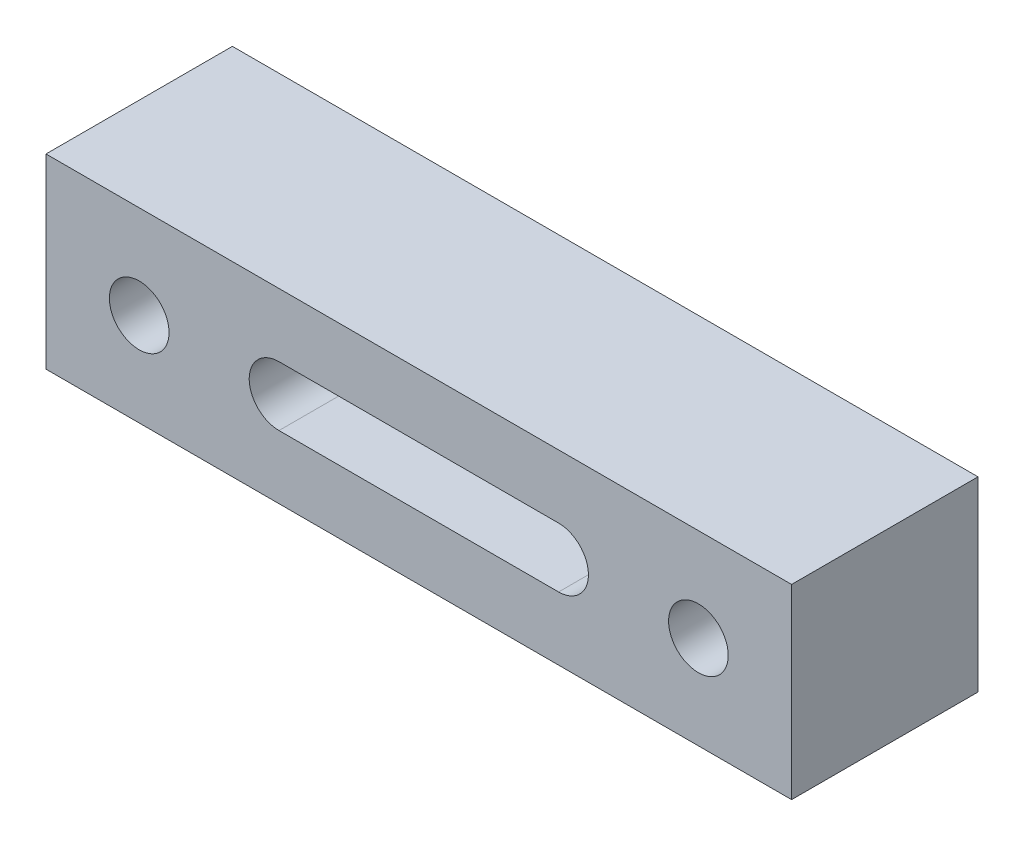
ISO-10303-21;
HEADER;
FILE_DESCRIPTION(('STEP AP214'),'2;1');
FILE_NAME('part.step','',(''),(''),'','','');
FILE_SCHEMA(('AUTOMOTIVE_DESIGN { 1 0 10303 214 1 1 1 1 }'));
ENDSEC;
DATA;
#1=APPLICATION_CONTEXT('core data for automotive mechanical design processes');
#2=APPLICATION_PROTOCOL_DEFINITION('international standard','automotive_design',2000,#1);
#3=PRODUCT_CONTEXT('',#1,'mechanical');
#4=PRODUCT('Part','Part','',(#3));
#5=PRODUCT_RELATED_PRODUCT_CATEGORY('part','',(#4));
#6=PRODUCT_DEFINITION_FORMATION('','',#4);
#7=PRODUCT_DEFINITION_CONTEXT('part definition',#1,'design');
#8=PRODUCT_DEFINITION('design','',#6,#7);
#9=PRODUCT_DEFINITION_SHAPE('','',#8);
#10=(LENGTH_UNIT() NAMED_UNIT(*) SI_UNIT(.MILLI.,.METRE.));
#11=(NAMED_UNIT(*) PLANE_ANGLE_UNIT() SI_UNIT($,.RADIAN.));
#12=(NAMED_UNIT(*) SI_UNIT($,.STERADIAN.) SOLID_ANGLE_UNIT());
#13=UNCERTAINTY_MEASURE_WITH_UNIT(LENGTH_MEASURE(1.E-05),#10,'distance_accuracy_value','');
#14=(GEOMETRIC_REPRESENTATION_CONTEXT(3) GLOBAL_UNCERTAINTY_ASSIGNED_CONTEXT((#13)) GLOBAL_UNIT_ASSIGNED_CONTEXT((#10,
#11,#12)) REPRESENTATION_CONTEXT('',''));
#15=CARTESIAN_POINT('',(0.,0.,0.));
#16=DIRECTION('',(0.,0.,1.));
#17=DIRECTION('',(1.,0.,0.));
#18=AXIS2_PLACEMENT_3D('',#15,#16,#17);
#19=CARTESIAN_POINT('',(-14.3181818181818,13.5885167464115,10.));
#20=DIRECTION('',(0.,0.,-1.));
#21=DIRECTION('',(-1.,0.,0.));
#22=AXIS2_PLACEMENT_3D('',#19,#20,#21);
#23=CYLINDRICAL_SURFACE('',#22,1.6);
#24=DIRECTION('',(0.,0.,-1.));
#25=VECTOR('',#24,1.);
#26=CARTESIAN_POINT('',(-14.3181818181818,11.9885167464115,10.));
#27=LINE('',#26,#25);
#28=CARTESIAN_POINT('',(-14.3181818181818,11.9885167464115,10.));
#29=VERTEX_POINT('',#28);
#30=CARTESIAN_POINT('',(-14.3181818181818,11.9885167464115,6.));
#31=VERTEX_POINT('',#30);
#32=EDGE_CURVE('E219',#29,#31,#27,.T.);
#33=ORIENTED_EDGE('',*,*,#32,.T.);
#34=CARTESIAN_POINT('',(-14.3181818181818,13.5885167464115,6.));
#35=DIRECTION('',(0.,0.,-1.));
#36=DIRECTION('',(-1.,0.,0.));
#37=AXIS2_PLACEMENT_3D('',#34,#35,#36);
#38=CIRCLE('',#37,1.6);
#39=CARTESIAN_POINT('',(-14.3181818181818,15.1885167464115,6.));
#40=VERTEX_POINT('',#39);
#41=EDGE_CURVE('E190',#31,#40,#38,.T.);
#42=ORIENTED_EDGE('',*,*,#41,.T.);
#43=DIRECTION('',(0.,0.,-1.));
#44=VECTOR('',#43,1.);
#45=CARTESIAN_POINT('',(-14.3181818181818,15.1885167464115,10.));
#46=LINE('',#45,#44);
#47=CARTESIAN_POINT('',(-14.3181818181818,15.1885167464115,10.));
#48=VERTEX_POINT('',#47);
#49=EDGE_CURVE('E207',#48,#40,#46,.T.);
#50=ORIENTED_EDGE('',*,*,#49,.F.);
#51=CARTESIAN_POINT('',(-14.3181818181818,13.5885167464115,10.));
#52=DIRECTION('',(0.,0.,1.));
#53=DIRECTION('',(1.,0.,0.));
#54=AXIS2_PLACEMENT_3D('',#51,#52,#53);
#55=CIRCLE('',#54,1.6);
#56=EDGE_CURVE('E194',#48,#29,#55,.T.);
#57=ORIENTED_EDGE('',*,*,#56,.T.);
#58=EDGE_LOOP('',(#33,#42,#50,#57));
#59=FACE_BOUND('',#58,.T.);
#60=ADVANCED_FACE('F45',(#59),#23,.F.);
#61=CARTESIAN_POINT('',(-14.3181818181818,11.9885167464115,10.));
#62=DIRECTION('',(0.,1.,0.));
#63=DIRECTION('',(-1.,0.,0.));
#64=AXIS2_PLACEMENT_3D('',#61,#62,#63);
#65=PLANE('',#64);
#66=DIRECTION('',(0.,0.,-1.));
#67=VECTOR('',#66,1.);
#68=CARTESIAN_POINT('',(0.681818181818196,11.9885167464115,10.));
#69=LINE('',#68,#67);
#70=CARTESIAN_POINT('',(0.681818181818196,11.9885167464115,10.));
#71=VERTEX_POINT('',#70);
#72=CARTESIAN_POINT('',(0.681818181818196,11.9885167464115,6.));
#73=VERTEX_POINT('',#72);
#74=EDGE_CURVE('E215',#71,#73,#69,.T.);
#75=ORIENTED_EDGE('',*,*,#74,.T.);
#76=DIRECTION('',(-1.,0.,0.));
#77=VECTOR('',#76,1.);
#78=CARTESIAN_POINT('',(-14.3181818181818,11.9885167464115,6.));
#79=LINE('',#78,#77);
#80=EDGE_CURVE('E186',#73,#31,#79,.T.);
#81=ORIENTED_EDGE('',*,*,#80,.T.);
#82=ORIENTED_EDGE('',*,*,#32,.F.);
#83=DIRECTION('',(1.,0.,0.));
#84=VECTOR('',#83,1.);
#85=CARTESIAN_POINT('',(-14.3181818181818,11.9885167464115,10.));
#86=LINE('',#85,#84);
#87=EDGE_CURVE('E197',#29,#71,#86,.T.);
#88=ORIENTED_EDGE('',*,*,#87,.T.);
#89=EDGE_LOOP('',(#75,#81,#82,#88));
#90=FACE_BOUND('',#89,.T.);
#91=ADVANCED_FACE('F313',(#90),#65,.T.);
#92=CARTESIAN_POINT('',(0.681818181818197,13.5885167464115,10.));
#93=DIRECTION('',(0.,0.,-1.));
#94=DIRECTION('',(-1.,0.,0.));
#95=AXIS2_PLACEMENT_3D('',#92,#93,#94);
#96=CYLINDRICAL_SURFACE('',#95,1.6);
#97=DIRECTION('',(0.,0.,-1.));
#98=VECTOR('',#97,1.);
#99=CARTESIAN_POINT('',(0.681818181818197,15.1885167464115,10.));
#100=LINE('',#99,#98);
#101=CARTESIAN_POINT('',(0.681818181818197,15.1885167464115,10.));
#102=VERTEX_POINT('',#101);
#103=CARTESIAN_POINT('',(0.681818181818197,15.1885167464115,6.));
#104=VERTEX_POINT('',#103);
#105=EDGE_CURVE('E211',#102,#104,#100,.T.);
#106=ORIENTED_EDGE('',*,*,#105,.T.);
#107=CARTESIAN_POINT('',(0.681818181818197,13.5885167464115,6.));
#108=DIRECTION('',(0.,0.,-1.));
#109=DIRECTION('',(-1.,0.,0.));
#110=AXIS2_PLACEMENT_3D('',#107,#108,#109);
#111=CIRCLE('',#110,1.6);
#112=EDGE_CURVE('E69',#104,#73,#111,.T.);
#113=ORIENTED_EDGE('',*,*,#112,.T.);
#114=ORIENTED_EDGE('',*,*,#74,.F.);
#115=CARTESIAN_POINT('',(0.681818181818197,13.5885167464115,10.));
#116=DIRECTION('',(0.,0.,1.));
#117=DIRECTION('',(1.,0.,0.));
#118=AXIS2_PLACEMENT_3D('',#115,#116,#117);
#119=CIRCLE('',#118,1.6);
#120=EDGE_CURVE('E200',#71,#102,#119,.T.);
#121=ORIENTED_EDGE('',*,*,#120,.T.);
#122=EDGE_LOOP('',(#106,#113,#114,#121));
#123=FACE_BOUND('',#122,.T.);
#124=ADVANCED_FACE('F315',(#123),#96,.F.);
#125=CARTESIAN_POINT('',(-14.3181818181818,15.1885167464115,10.));
#126=DIRECTION('',(0.,-1.,0.));
#127=DIRECTION('',(1.,0.,0.));
#128=AXIS2_PLACEMENT_3D('',#125,#126,#127);
#129=PLANE('',#128);
#130=ORIENTED_EDGE('',*,*,#49,.T.);
#131=DIRECTION('',(1.,0.,0.));
#132=VECTOR('',#131,1.);
#133=CARTESIAN_POINT('',(-14.3181818181818,15.1885167464115,6.));
#134=LINE('',#133,#132);
#135=EDGE_CURVE('E12',#40,#104,#134,.T.);
#136=ORIENTED_EDGE('',*,*,#135,.T.);
#137=ORIENTED_EDGE('',*,*,#105,.F.);
#138=DIRECTION('',(-1.,0.,0.));
#139=VECTOR('',#138,1.);
#140=CARTESIAN_POINT('',(-14.3181818181818,15.1885167464115,10.));
#141=LINE('',#140,#139);
#142=EDGE_CURVE('E204',#102,#48,#141,.T.);
#143=ORIENTED_EDGE('',*,*,#142,.T.);
#144=EDGE_LOOP('',(#130,#136,#137,#143));
#145=FACE_BOUND('',#144,.T.);
#146=ADVANCED_FACE('F301',(#145),#129,.T.);
#147=CARTESIAN_POINT('',(0.,0.,10.));
#148=DIRECTION('',(0.,0.,1.));
#149=DIRECTION('',(1.,0.,0.));
#150=AXIS2_PLACEMENT_3D('',#147,#148,#149);
#151=PLANE('',#150);
#152=CARTESIAN_POINT('',(-21.8181818181818,13.5885167464115,10.));
#153=DIRECTION('',(0.,0.,1.));
#154=DIRECTION('',(1.,0.,0.));
#155=AXIS2_PLACEMENT_3D('',#152,#153,#154);
#156=CIRCLE('',#155,1.6);
#157=CARTESIAN_POINT('',(-20.2181818181818,13.5885167464115,10.));
#158=VERTEX_POINT('',#157);
#159=EDGE_CURVE('E232',#158,#158,#156,.T.);
#160=ORIENTED_EDGE('',*,*,#159,.F.);
#161=EDGE_LOOP('',(#160));
#162=FACE_BOUND('',#161,.T.);
#163=DIRECTION('',(0.,-1.,0.));
#164=VECTOR('',#163,1.);
#165=CARTESIAN_POINT('',(-26.8181818181818,18.5885167464115,10.));
#166=LINE('',#165,#164);
#167=CARTESIAN_POINT('',(-26.8181818181818,18.5885167464115,10.));
#168=VERTEX_POINT('',#167);
#169=CARTESIAN_POINT('',(-26.8181818181818,8.58851674641148,10.));
#170=VERTEX_POINT('',#169);
#171=EDGE_CURVE('E240',#168,#170,#166,.T.);
#172=ORIENTED_EDGE('',*,*,#171,.T.);
#173=DIRECTION('',(1.,0.,0.));
#174=VECTOR('',#173,1.);
#175=CARTESIAN_POINT('',(-26.8181818181818,8.58851674641148,10.));
#176=LINE('',#175,#174);
#177=CARTESIAN_POINT('',(13.1818181818182,8.58851674641148,10.));
#178=VERTEX_POINT('',#177);
#179=EDGE_CURVE('E244',#170,#178,#176,.T.);
#180=ORIENTED_EDGE('',*,*,#179,.T.);
#181=DIRECTION('',(0.,1.,0.));
#182=VECTOR('',#181,1.);
#183=CARTESIAN_POINT('',(13.1818181818182,18.5885167464115,10.));
#184=LINE('',#183,#182);
#185=CARTESIAN_POINT('',(13.1818181818182,18.5885167464115,10.));
#186=VERTEX_POINT('',#185);
#187=EDGE_CURVE('E248',#178,#186,#184,.T.);
#188=ORIENTED_EDGE('',*,*,#187,.T.);
#189=DIRECTION('',(-1.,0.,0.));
#190=VECTOR('',#189,1.);
#191=CARTESIAN_POINT('',(-26.8181818181818,18.5885167464115,10.));
#192=LINE('',#191,#190);
#193=EDGE_CURVE('E251',#186,#168,#192,.T.);
#194=ORIENTED_EDGE('',*,*,#193,.T.);
#195=EDGE_LOOP('',(#172,#180,#188,#194));
#196=FACE_BOUND('',#195,.T.);
#197=CARTESIAN_POINT('',(8.18181818181819,13.5885167464115,10.));
#198=DIRECTION('',(0.,0.,1.));
#199=DIRECTION('',(1.,0.,0.));
#200=AXIS2_PLACEMENT_3D('',#197,#198,#199);
#201=CIRCLE('',#200,1.6);
#202=CARTESIAN_POINT('',(9.7818181818182,13.5885167464115,10.));
#203=VERTEX_POINT('',#202);
#204=EDGE_CURVE('E224',#203,#203,#201,.T.);
#205=ORIENTED_EDGE('',*,*,#204,.F.);
#206=EDGE_LOOP('',(#205));
#207=FACE_BOUND('',#206,.T.);
#208=ORIENTED_EDGE('',*,*,#87,.F.);
#209=ORIENTED_EDGE('',*,*,#56,.F.);
#210=ORIENTED_EDGE('',*,*,#142,.F.);
#211=ORIENTED_EDGE('',*,*,#120,.F.);
#212=EDGE_LOOP('',(#208,#209,#210,#211));
#213=FACE_BOUND('',#212,.T.);
#214=ADVANCED_FACE('F298',(#162,#196,#207,#213),#151,.T.);
#215=CARTESIAN_POINT('',(0.,0.,0.));
#216=DIRECTION('',(0.,0.,1.));
#217=DIRECTION('',(1.,0.,0.));
#218=AXIS2_PLACEMENT_3D('',#215,#216,#217);
#219=PLANE('',#218);
#220=DIRECTION('',(-1.,0.,0.));
#221=VECTOR('',#220,1.);
#222=CARTESIAN_POINT('',(3.1818181818182,10.5885167464115,0.));
#223=LINE('',#222,#221);
#224=CARTESIAN_POINT('',(3.1818181818182,10.5885167464115,0.));
#225=VERTEX_POINT('',#224);
#226=CARTESIAN_POINT('',(-16.8181818181818,10.5885167464115,0.));
#227=VERTEX_POINT('',#226);
#228=EDGE_CURVE('E170',#225,#227,#223,.T.);
#229=ORIENTED_EDGE('',*,*,#228,.F.);
#230=DIRECTION('',(0.,-1.,0.));
#231=VECTOR('',#230,1.);
#232=CARTESIAN_POINT('',(3.1818181818182,16.5885167464115,0.));
#233=LINE('',#232,#231);
#234=CARTESIAN_POINT('',(3.1818181818182,16.5885167464115,0.));
#235=VERTEX_POINT('',#234);
#236=EDGE_CURVE('E61',#235,#225,#233,.T.);
#237=ORIENTED_EDGE('',*,*,#236,.F.);
#238=DIRECTION('',(1.,0.,0.));
#239=VECTOR('',#238,1.);
#240=CARTESIAN_POINT('',(3.1818181818182,16.5885167464115,0.));
#241=LINE('',#240,#239);
#242=CARTESIAN_POINT('',(-16.8181818181818,16.5885167464115,0.));
#243=VERTEX_POINT('',#242);
#244=EDGE_CURVE('E157',#243,#235,#241,.T.);
#245=ORIENTED_EDGE('',*,*,#244,.F.);
#246=DIRECTION('',(0.,1.,0.));
#247=VECTOR('',#246,1.);
#248=CARTESIAN_POINT('',(-16.8181818181818,16.5885167464115,0.));
#249=LINE('',#248,#247);
#250=EDGE_CURVE('E161',#227,#243,#249,.T.);
#251=ORIENTED_EDGE('',*,*,#250,.F.);
#252=EDGE_LOOP('',(#229,#237,#245,#251));
#253=FACE_BOUND('',#252,.T.);
#254=CARTESIAN_POINT('',(8.18181818181819,13.5885167464115,0.));
#255=DIRECTION('',(0.,0.,1.));
#256=DIRECTION('',(1.,0.,0.));
#257=AXIS2_PLACEMENT_3D('',#254,#255,#256);
#258=CIRCLE('',#257,1.6);
#259=CARTESIAN_POINT('',(9.7818181818182,13.5885167464115,0.));
#260=VERTEX_POINT('',#259);
#261=EDGE_CURVE('E223',#260,#260,#258,.T.);
#262=ORIENTED_EDGE('',*,*,#261,.T.);
#263=EDGE_LOOP('',(#262));
#264=FACE_BOUND('',#263,.T.);
#265=CARTESIAN_POINT('',(-21.8181818181818,13.5885167464115,0.));
#266=DIRECTION('',(0.,0.,1.));
#267=DIRECTION('',(1.,0.,0.));
#268=AXIS2_PLACEMENT_3D('',#265,#266,#267);
#269=CIRCLE('',#268,1.6);
#270=CARTESIAN_POINT('',(-20.2181818181818,13.5885167464115,0.));
#271=VERTEX_POINT('',#270);
#272=EDGE_CURVE('E228',#271,#271,#269,.T.);
#273=ORIENTED_EDGE('',*,*,#272,.T.);
#274=EDGE_LOOP('',(#273));
#275=FACE_BOUND('',#274,.T.);
#276=DIRECTION('',(0.,-1.,0.));
#277=VECTOR('',#276,1.);
#278=CARTESIAN_POINT('',(-26.8181818181818,18.5885167464115,0.));
#279=LINE('',#278,#277);
#280=CARTESIAN_POINT('',(-26.8181818181818,18.5885167464115,0.));
#281=VERTEX_POINT('',#280);
#282=CARTESIAN_POINT('',(-26.8181818181818,8.58851674641148,0.));
#283=VERTEX_POINT('',#282);
#284=EDGE_CURVE('E236',#281,#283,#279,.T.);
#285=ORIENTED_EDGE('',*,*,#284,.F.);
#286=DIRECTION('',(-1.,0.,0.));
#287=VECTOR('',#286,1.);
#288=CARTESIAN_POINT('',(-26.8181818181818,18.5885167464115,0.));
#289=LINE('',#288,#287);
#290=CARTESIAN_POINT('',(13.1818181818182,18.5885167464115,0.));
#291=VERTEX_POINT('',#290);
#292=EDGE_CURVE('E245',#291,#281,#289,.T.);
#293=ORIENTED_EDGE('',*,*,#292,.F.);
#294=DIRECTION('',(0.,1.,0.));
#295=VECTOR('',#294,1.);
#296=CARTESIAN_POINT('',(13.1818181818182,18.5885167464115,0.));
#297=LINE('',#296,#295);
#298=CARTESIAN_POINT('',(13.1818181818182,8.58851674641148,0.));
#299=VERTEX_POINT('',#298);
#300=EDGE_CURVE('E261',#299,#291,#297,.T.);
#301=ORIENTED_EDGE('',*,*,#300,.F.);
#302=DIRECTION('',(1.,0.,0.));
#303=VECTOR('',#302,1.);
#304=CARTESIAN_POINT('',(-26.8181818181818,8.58851674641148,0.));
#305=LINE('',#304,#303);
#306=EDGE_CURVE('E258',#283,#299,#305,.T.);
#307=ORIENTED_EDGE('',*,*,#306,.F.);
#308=EDGE_LOOP('',(#285,#293,#301,#307));
#309=FACE_BOUND('',#308,.T.);
#310=ADVANCED_FACE('F288',(#253,#264,#275,#309),#219,.F.);
#311=CARTESIAN_POINT('',(-26.8181818181818,18.5885167464115,10.));
#312=DIRECTION('',(1.,0.,0.));
#313=DIRECTION('',(0.,1.,0.));
#314=AXIS2_PLACEMENT_3D('',#311,#312,#313);
#315=PLANE('',#314);
#316=ORIENTED_EDGE('',*,*,#284,.T.);
#317=DIRECTION('',(0.,0.,-1.));
#318=VECTOR('',#317,1.);
#319=CARTESIAN_POINT('',(-26.8181818181818,8.58851674641148,10.));
#320=LINE('',#319,#318);
#321=EDGE_CURVE('E54',#170,#283,#320,.T.);
#322=ORIENTED_EDGE('',*,*,#321,.F.);
#323=ORIENTED_EDGE('',*,*,#171,.F.);
#324=DIRECTION('',(0.,0.,-1.));
#325=VECTOR('',#324,1.);
#326=CARTESIAN_POINT('',(-26.8181818181818,18.5885167464115,10.));
#327=LINE('',#326,#325);
#328=EDGE_CURVE('E254',#168,#281,#327,.T.);
#329=ORIENTED_EDGE('',*,*,#328,.T.);
#330=EDGE_LOOP('',(#316,#322,#323,#329));
#331=FACE_BOUND('',#330,.T.);
#332=ADVANCED_FACE('F47',(#331),#315,.F.);
#333=CARTESIAN_POINT('',(-26.8181818181818,8.58851674641148,10.));
#334=DIRECTION('',(0.,1.,0.));
#335=DIRECTION('',(0.,0.,1.));
#336=AXIS2_PLACEMENT_3D('',#333,#334,#335);
#337=PLANE('',#336);
#338=ORIENTED_EDGE('',*,*,#306,.T.);
#339=DIRECTION('',(0.,0.,-1.));
#340=VECTOR('',#339,1.);
#341=CARTESIAN_POINT('',(13.1818181818182,8.58851674641148,10.));
#342=LINE('',#341,#340);
#343=EDGE_CURVE('E273',#178,#299,#342,.T.);
#344=ORIENTED_EDGE('',*,*,#343,.F.);
#345=ORIENTED_EDGE('',*,*,#179,.F.);
#346=ORIENTED_EDGE('',*,*,#321,.T.);
#347=EDGE_LOOP('',(#338,#344,#345,#346));
#348=FACE_BOUND('',#347,.T.);
#349=ADVANCED_FACE('F280',(#348),#337,.F.);
#350=CARTESIAN_POINT('',(13.1818181818182,18.5885167464115,10.));
#351=DIRECTION('',(-1.,0.,0.));
#352=DIRECTION('',(0.,-1.,0.));
#353=AXIS2_PLACEMENT_3D('',#350,#351,#352);
#354=PLANE('',#353);
#355=ORIENTED_EDGE('',*,*,#300,.T.);
#356=DIRECTION('',(0.,0.,-1.));
#357=VECTOR('',#356,1.);
#358=CARTESIAN_POINT('',(13.1818181818182,18.5885167464115,10.));
#359=LINE('',#358,#357);
#360=EDGE_CURVE('E269',#186,#291,#359,.T.);
#361=ORIENTED_EDGE('',*,*,#360,.F.);
#362=ORIENTED_EDGE('',*,*,#187,.F.);
#363=ORIENTED_EDGE('',*,*,#343,.T.);
#364=EDGE_LOOP('',(#355,#361,#362,#363));
#365=FACE_BOUND('',#364,.T.);
#366=ADVANCED_FACE('F292',(#365),#354,.F.);
#367=CARTESIAN_POINT('',(-26.8181818181818,18.5885167464115,10.));
#368=DIRECTION('',(0.,-1.,0.));
#369=DIRECTION('',(0.,0.,-1.));
#370=AXIS2_PLACEMENT_3D('',#367,#368,#369);
#371=PLANE('',#370);
#372=ORIENTED_EDGE('',*,*,#292,.T.);
#373=ORIENTED_EDGE('',*,*,#328,.F.);
#374=ORIENTED_EDGE('',*,*,#193,.F.);
#375=ORIENTED_EDGE('',*,*,#360,.T.);
#376=EDGE_LOOP('',(#372,#373,#374,#375));
#377=FACE_BOUND('',#376,.T.);
#378=ADVANCED_FACE('F296',(#377),#371,.F.);
#379=CARTESIAN_POINT('',(-21.8181818181818,13.5885167464115,10.));
#380=DIRECTION('',(0.,0.,-1.));
#381=DIRECTION('',(-1.,0.,0.));
#382=AXIS2_PLACEMENT_3D('',#379,#380,#381);
#383=CYLINDRICAL_SURFACE('',#382,1.6);
#384=ORIENTED_EDGE('',*,*,#159,.T.);
#385=EDGE_LOOP('',(#384));
#386=FACE_BOUND('',#385,.T.);
#387=ORIENTED_EDGE('',*,*,#272,.F.);
#388=EDGE_LOOP('',(#387));
#389=FACE_BOUND('',#388,.T.);
#390=ADVANCED_FACE('F330',(#386,#389),#383,.F.);
#391=CARTESIAN_POINT('',(8.18181818181819,13.5885167464115,10.));
#392=DIRECTION('',(0.,0.,-1.));
#393=DIRECTION('',(-1.,0.,0.));
#394=AXIS2_PLACEMENT_3D('',#391,#392,#393);
#395=CYLINDRICAL_SURFACE('',#394,1.6);
#396=ORIENTED_EDGE('',*,*,#204,.T.);
#397=EDGE_LOOP('',(#396));
#398=FACE_BOUND('',#397,.T.);
#399=ORIENTED_EDGE('',*,*,#261,.F.);
#400=EDGE_LOOP('',(#399));
#401=FACE_BOUND('',#400,.T.);
#402=ADVANCED_FACE('F327',(#398,#401),#395,.F.);
#403=CARTESIAN_POINT('',(3.1818181818182,16.5885167464115,6.));
#404=DIRECTION('',(1.,0.,0.));
#405=DIRECTION('',(0.,1.,0.));
#406=AXIS2_PLACEMENT_3D('',#403,#404,#405);
#407=PLANE('',#406);
#408=ORIENTED_EDGE('',*,*,#236,.T.);
#409=DIRECTION('',(0.,0.,-1.));
#410=VECTOR('',#409,1.);
#411=CARTESIAN_POINT('',(3.1818181818182,10.5885167464115,6.));
#412=LINE('',#411,#410);
#413=CARTESIAN_POINT('',(3.1818181818182,10.5885167464115,6.));
#414=VERTEX_POINT('',#413);
#415=EDGE_CURVE('E132',#414,#225,#412,.T.);
#416=ORIENTED_EDGE('',*,*,#415,.F.);
#417=DIRECTION('',(0.,-1.,0.));
#418=VECTOR('',#417,1.);
#419=CARTESIAN_POINT('',(3.1818181818182,16.5885167464115,6.));
#420=LINE('',#419,#418);
#421=CARTESIAN_POINT('',(3.1818181818182,16.5885167464115,6.));
#422=VERTEX_POINT('',#421);
#423=EDGE_CURVE('E136',#422,#414,#420,.T.);
#424=ORIENTED_EDGE('',*,*,#423,.F.);
#425=DIRECTION('',(0.,0.,-1.));
#426=VECTOR('',#425,1.);
#427=CARTESIAN_POINT('',(3.1818181818182,16.5885167464115,6.));
#428=LINE('',#427,#426);
#429=EDGE_CURVE('E176',#422,#235,#428,.T.);
#430=ORIENTED_EDGE('',*,*,#429,.T.);
#431=EDGE_LOOP('',(#408,#416,#424,#430));
#432=FACE_BOUND('',#431,.T.);
#433=ADVANCED_FACE('F134',(#432),#407,.F.);
#434=CARTESIAN_POINT('',(3.1818181818182,16.5885167464115,6.));
#435=DIRECTION('',(0.,1.,0.));
#436=DIRECTION('',(0.,0.,1.));
#437=AXIS2_PLACEMENT_3D('',#434,#435,#436);
#438=PLANE('',#437);
#439=ORIENTED_EDGE('',*,*,#244,.T.);
#440=ORIENTED_EDGE('',*,*,#429,.F.);
#441=DIRECTION('',(1.,0.,0.));
#442=VECTOR('',#441,1.);
#443=CARTESIAN_POINT('',(3.1818181818182,16.5885167464115,6.));
#444=LINE('',#443,#442);
#445=CARTESIAN_POINT('',(-16.8181818181818,16.5885167464115,6.));
#446=VERTEX_POINT('',#445);
#447=EDGE_CURVE('E143',#446,#422,#444,.T.);
#448=ORIENTED_EDGE('',*,*,#447,.F.);
#449=DIRECTION('',(0.,0.,-1.));
#450=VECTOR('',#449,1.);
#451=CARTESIAN_POINT('',(-16.8181818181818,16.5885167464115,6.));
#452=LINE('',#451,#450);
#453=EDGE_CURVE('E179',#446,#243,#452,.T.);
#454=ORIENTED_EDGE('',*,*,#453,.T.);
#455=EDGE_LOOP('',(#439,#440,#448,#454));
#456=FACE_BOUND('',#455,.T.);
#457=ADVANCED_FACE('F447',(#456),#438,.F.);
#458=CARTESIAN_POINT('',(-16.8181818181818,16.5885167464115,6.));
#459=DIRECTION('',(-1.,0.,0.));
#460=DIRECTION('',(0.,0.,1.));
#461=AXIS2_PLACEMENT_3D('',#458,#459,#460);
#462=PLANE('',#461);
#463=ORIENTED_EDGE('',*,*,#250,.T.);
#464=ORIENTED_EDGE('',*,*,#453,.F.);
#465=DIRECTION('',(0.,1.,0.));
#466=VECTOR('',#465,1.);
#467=CARTESIAN_POINT('',(-16.8181818181818,16.5885167464115,6.));
#468=LINE('',#467,#466);
#469=CARTESIAN_POINT('',(-16.8181818181818,10.5885167464115,6.));
#470=VERTEX_POINT('',#469);
#471=EDGE_CURVE('E152',#470,#446,#468,.T.);
#472=ORIENTED_EDGE('',*,*,#471,.F.);
#473=DIRECTION('',(0.,0.,-1.));
#474=VECTOR('',#473,1.);
#475=CARTESIAN_POINT('',(-16.8181818181818,10.5885167464115,6.));
#476=LINE('',#475,#474);
#477=EDGE_CURVE('E142',#470,#227,#476,.T.);
#478=ORIENTED_EDGE('',*,*,#477,.T.);
#479=EDGE_LOOP('',(#463,#464,#472,#478));
#480=FACE_BOUND('',#479,.T.);
#481=ADVANCED_FACE('F457',(#480),#462,.F.);
#482=CARTESIAN_POINT('',(3.1818181818182,10.5885167464115,6.));
#483=DIRECTION('',(0.,-1.,0.));
#484=DIRECTION('',(0.,0.,-1.));
#485=AXIS2_PLACEMENT_3D('',#482,#483,#484);
#486=PLANE('',#485);
#487=ORIENTED_EDGE('',*,*,#228,.T.);
#488=ORIENTED_EDGE('',*,*,#477,.F.);
#489=DIRECTION('',(-1.,0.,0.));
#490=VECTOR('',#489,1.);
#491=CARTESIAN_POINT('',(3.1818181818182,10.5885167464115,6.));
#492=LINE('',#491,#490);
#493=EDGE_CURVE('E146',#414,#470,#492,.T.);
#494=ORIENTED_EDGE('',*,*,#493,.F.);
#495=ORIENTED_EDGE('',*,*,#415,.T.);
#496=EDGE_LOOP('',(#487,#488,#494,#495));
#497=FACE_BOUND('',#496,.T.);
#498=ADVANCED_FACE('F147',(#497),#486,.F.);
#499=CARTESIAN_POINT('',(0.,0.,6.));
#500=DIRECTION('',(0.,0.,-1.));
#501=DIRECTION('',(-1.,0.,0.));
#502=AXIS2_PLACEMENT_3D('',#499,#500,#501);
#503=PLANE('',#502);
#504=ORIENTED_EDGE('',*,*,#80,.F.);
#505=ORIENTED_EDGE('',*,*,#112,.F.);
#506=ORIENTED_EDGE('',*,*,#135,.F.);
#507=ORIENTED_EDGE('',*,*,#41,.F.);
#508=EDGE_LOOP('',(#504,#505,#506,#507));
#509=FACE_BOUND('',#508,.T.);
#510=ORIENTED_EDGE('',*,*,#423,.T.);
#511=ORIENTED_EDGE('',*,*,#493,.T.);
#512=ORIENTED_EDGE('',*,*,#471,.T.);
#513=ORIENTED_EDGE('',*,*,#447,.T.);
#514=EDGE_LOOP('',(#510,#511,#512,#513));
#515=FACE_BOUND('',#514,.T.);
#516=ADVANCED_FACE('F154',(#509,#515),#503,.T.);
#517=CLOSED_SHELL('',(#60,#91,#124,#146,#214,#310,#332,#349,#366,#378,#390,#402,#433,#457,#481,
#498,#516));
#518=MANIFOLD_SOLID_BREP('B2',#517);
#519=ADVANCED_BREP_SHAPE_REPRESENTATION('',(#18,#518),#14);
#520=SHAPE_DEFINITION_REPRESENTATION(#9,#519);
ENDSEC;
END-ISO-10303-21;
